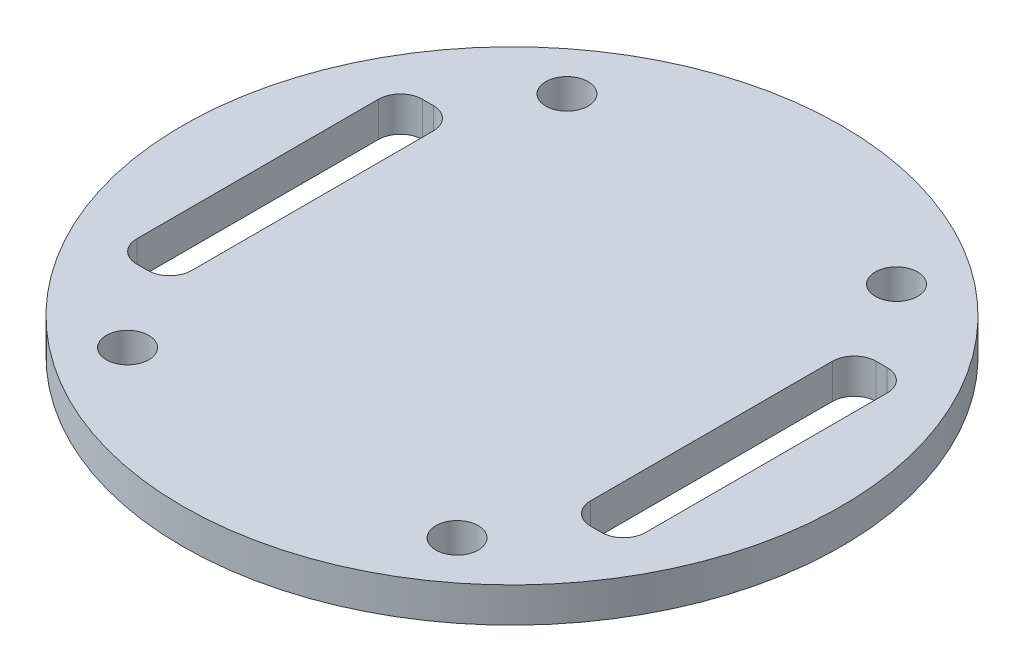
ISO-10303-21;
HEADER;
FILE_DESCRIPTION(('STEP AP214'),'2;1');
FILE_NAME('part.step','',(''),(''),'','','');
FILE_SCHEMA(('AUTOMOTIVE_DESIGN { 1 0 10303 214 1 1 1 1 }'));
ENDSEC;
DATA;
#1=APPLICATION_CONTEXT('core data for automotive mechanical design processes');
#2=APPLICATION_PROTOCOL_DEFINITION('international standard','automotive_design',2000,#1);
#3=PRODUCT_CONTEXT('',#1,'mechanical');
#4=PRODUCT('Part','Part','',(#3));
#5=PRODUCT_RELATED_PRODUCT_CATEGORY('part','',(#4));
#6=PRODUCT_DEFINITION_FORMATION('','',#4);
#7=PRODUCT_DEFINITION_CONTEXT('part definition',#1,'design');
#8=PRODUCT_DEFINITION('design','',#6,#7);
#9=PRODUCT_DEFINITION_SHAPE('','',#8);
#10=(LENGTH_UNIT() NAMED_UNIT(*) SI_UNIT(.MILLI.,.METRE.));
#11=(NAMED_UNIT(*) PLANE_ANGLE_UNIT() SI_UNIT($,.RADIAN.));
#12=(NAMED_UNIT(*) SI_UNIT($,.STERADIAN.) SOLID_ANGLE_UNIT());
#13=UNCERTAINTY_MEASURE_WITH_UNIT(LENGTH_MEASURE(1.E-05),#10,'distance_accuracy_value','');
#14=(GEOMETRIC_REPRESENTATION_CONTEXT(3) GLOBAL_UNCERTAINTY_ASSIGNED_CONTEXT((#13)) GLOBAL_UNIT_ASSIGNED_CONTEXT((#10,
#11,#12)) REPRESENTATION_CONTEXT('',''));
#15=CARTESIAN_POINT('',(0.,0.,0.));
#16=DIRECTION('',(0.,0.,1.));
#17=DIRECTION('',(1.,0.,0.));
#18=AXIS2_PLACEMENT_3D('',#15,#16,#17);
#19=CARTESIAN_POINT('',(0.,1.5875,0.));
#20=DIRECTION('',(0.,-1.,0.));
#21=DIRECTION('',(0.,0.,-1.));
#22=AXIS2_PLACEMENT_3D('',#19,#20,#21);
#23=CYLINDRICAL_SURFACE('',#22,30.);
#24=CARTESIAN_POINT('',(0.,1.5875,0.));
#25=DIRECTION('',(0.,1.,0.));
#26=DIRECTION('',(0.,0.,1.));
#27=AXIS2_PLACEMENT_3D('',#24,#25,#26);
#28=CIRCLE('',#27,30.);
#29=CARTESIAN_POINT('',(0.,1.5875,30.));
#30=VERTEX_POINT('',#29);
#31=EDGE_CURVE('E207',#30,#30,#28,.T.);
#32=ORIENTED_EDGE('',*,*,#31,.F.);
#33=EDGE_LOOP('',(#32));
#34=FACE_BOUND('',#33,.T.);
#35=CARTESIAN_POINT('',(0.,-1.5875,0.));
#36=DIRECTION('',(0.,1.,0.));
#37=DIRECTION('',(0.,0.,1.));
#38=AXIS2_PLACEMENT_3D('',#35,#36,#37);
#39=CIRCLE('',#38,30.);
#40=CARTESIAN_POINT('',(0.,-1.5875,30.));
#41=VERTEX_POINT('',#40);
#42=EDGE_CURVE('E195',#41,#41,#39,.T.);
#43=ORIENTED_EDGE('',*,*,#42,.T.);
#44=EDGE_LOOP('',(#43));
#45=FACE_BOUND('',#44,.T.);
#46=ADVANCED_FACE('F31',(#34,#45),#23,.T.);
#47=CARTESIAN_POINT('',(0.,1.5875,0.));
#48=DIRECTION('',(0.,1.,0.));
#49=DIRECTION('',(0.,0.,1.));
#50=AXIS2_PLACEMENT_3D('',#47,#48,#49);
#51=PLANE('',#50);
#52=CARTESIAN_POINT('',(15.,1.5875,-20.));
#53=DIRECTION('',(0.,1.,0.));
#54=DIRECTION('',(0.,0.,1.));
#55=AXIS2_PLACEMENT_3D('',#52,#53,#54);
#56=CIRCLE('',#55,1.9304);
#57=CARTESIAN_POINT('',(15.,1.5875,-18.0696));
#58=VERTEX_POINT('',#57);
#59=EDGE_CURVE('E550',#58,#58,#56,.T.);
#60=ORIENTED_EDGE('',*,*,#59,.F.);
#61=EDGE_LOOP('',(#60));
#62=FACE_BOUND('',#61,.T.);
#63=CARTESIAN_POINT('',(15.,1.5875,20.));
#64=DIRECTION('',(0.,1.,0.));
#65=DIRECTION('',(0.,0.,1.));
#66=AXIS2_PLACEMENT_3D('',#63,#64,#65);
#67=CIRCLE('',#66,1.9304);
#68=CARTESIAN_POINT('',(15.,1.5875,21.9304));
#69=VERTEX_POINT('',#68);
#70=EDGE_CURVE('E544',#69,#69,#67,.T.);
#71=ORIENTED_EDGE('',*,*,#70,.F.);
#72=EDGE_LOOP('',(#71));
#73=FACE_BOUND('',#72,.T.);
#74=CARTESIAN_POINT('',(-15.,1.5875,20.));
#75=DIRECTION('',(0.,1.,0.));
#76=DIRECTION('',(0.,0.,1.));
#77=AXIS2_PLACEMENT_3D('',#74,#75,#76);
#78=CIRCLE('',#77,1.9304);
#79=CARTESIAN_POINT('',(-15.,1.5875,21.9304));
#80=VERTEX_POINT('',#79);
#81=EDGE_CURVE('E538',#80,#80,#78,.T.);
#82=ORIENTED_EDGE('',*,*,#81,.F.);
#83=EDGE_LOOP('',(#82));
#84=FACE_BOUND('',#83,.T.);
#85=CARTESIAN_POINT('',(-15.,1.5875,-20.));
#86=DIRECTION('',(0.,1.,0.));
#87=DIRECTION('',(0.,0.,1.));
#88=AXIS2_PLACEMENT_3D('',#85,#86,#87);
#89=CIRCLE('',#88,1.9304);
#90=CARTESIAN_POINT('',(-15.,1.5875,-18.0696));
#91=VERTEX_POINT('',#90);
#92=EDGE_CURVE('E532',#91,#91,#89,.T.);
#93=ORIENTED_EDGE('',*,*,#92,.F.);
#94=EDGE_LOOP('',(#93));
#95=FACE_BOUND('',#94,.T.);
#96=DIRECTION('',(0.,0.,-1.));
#97=VECTOR('',#96,1.);
#98=CARTESIAN_POINT('',(23.1571046329841,1.5875,-13.));
#99=LINE('',#98,#97);
#100=CARTESIAN_POINT('',(23.1571046329841,1.5875,11.));
#101=VERTEX_POINT('',#100);
#102=CARTESIAN_POINT('',(23.1571046329841,1.5875,-11.));
#103=VERTEX_POINT('',#102);
#104=EDGE_CURVE('E180',#101,#103,#99,.T.);
#105=ORIENTED_EDGE('',*,*,#104,.F.);
#106=CARTESIAN_POINT('',(21.1571046329841,1.5875,11.));
#107=DIRECTION('',(0.,1.,0.));
#108=DIRECTION('',(0.,0.,1.));
#109=AXIS2_PLACEMENT_3D('',#106,#107,#108);
#110=CIRCLE('',#109,2.);
#111=CARTESIAN_POINT('',(21.1571046329841,1.5875,13.));
#112=VERTEX_POINT('',#111);
#113=EDGE_CURVE('E249',#101,#112,#110,.F.);
#114=ORIENTED_EDGE('',*,*,#113,.T.);
#115=DIRECTION('',(1.,0.,0.));
#116=VECTOR('',#115,1.);
#117=CARTESIAN_POINT('',(23.1571046329841,1.5875,13.));
#118=LINE('',#117,#116);
#119=CARTESIAN_POINT('',(20.1571046329841,1.5875,13.));
#120=VERTEX_POINT('',#119);
#121=EDGE_CURVE('E174',#120,#112,#118,.T.);
#122=ORIENTED_EDGE('',*,*,#121,.F.);
#123=CARTESIAN_POINT('',(20.1571046329841,1.5875,11.));
#124=DIRECTION('',(0.,1.,0.));
#125=DIRECTION('',(0.,0.,1.));
#126=AXIS2_PLACEMENT_3D('',#123,#124,#125);
#127=CIRCLE('',#126,2.);
#128=CARTESIAN_POINT('',(18.1571046329841,1.5875,11.));
#129=VERTEX_POINT('',#128);
#130=EDGE_CURVE('E173',#120,#129,#127,.F.);
#131=ORIENTED_EDGE('',*,*,#130,.T.);
#132=DIRECTION('',(0.,0.,1.));
#133=VECTOR('',#132,1.);
#134=CARTESIAN_POINT('',(18.1571046329841,1.5875,-13.));
#135=LINE('',#134,#133);
#136=CARTESIAN_POINT('',(18.1571046329841,1.5875,-11.));
#137=VERTEX_POINT('',#136);
#138=EDGE_CURVE('E162',#137,#129,#135,.T.);
#139=ORIENTED_EDGE('',*,*,#138,.F.);
#140=CARTESIAN_POINT('',(20.1571046329841,1.5875,-11.));
#141=DIRECTION('',(0.,1.,0.));
#142=DIRECTION('',(0.,0.,1.));
#143=AXIS2_PLACEMENT_3D('',#140,#141,#142);
#144=CIRCLE('',#143,2.);
#145=CARTESIAN_POINT('',(20.1571046329841,1.5875,-13.));
#146=VERTEX_POINT('',#145);
#147=EDGE_CURVE('E145',#137,#146,#144,.F.);
#148=ORIENTED_EDGE('',*,*,#147,.T.);
#149=DIRECTION('',(-1.,0.,0.));
#150=VECTOR('',#149,1.);
#151=CARTESIAN_POINT('',(23.1571046329841,1.5875,-13.));
#152=LINE('',#151,#150);
#153=CARTESIAN_POINT('',(21.1571046329841,1.5875,-13.));
#154=VERTEX_POINT('',#153);
#155=EDGE_CURVE('E175',#154,#146,#152,.T.);
#156=ORIENTED_EDGE('',*,*,#155,.F.);
#157=CARTESIAN_POINT('',(21.1571046329841,1.5875,-11.));
#158=DIRECTION('',(0.,1.,0.));
#159=DIRECTION('',(0.,0.,1.));
#160=AXIS2_PLACEMENT_3D('',#157,#158,#159);
#161=CIRCLE('',#160,2.);
#162=EDGE_CURVE('E245',#154,#103,#161,.F.);
#163=ORIENTED_EDGE('',*,*,#162,.T.);
#164=EDGE_LOOP('',(#105,#114,#122,#131,#139,#148,#156,#163));
#165=FACE_BOUND('',#164,.T.);
#166=DIRECTION('',(0.,0.,1.));
#167=VECTOR('',#166,1.);
#168=CARTESIAN_POINT('',(-23.1571046329841,1.5875,-13.));
#169=LINE('',#168,#167);
#170=CARTESIAN_POINT('',(-23.1571046329841,1.5875,-11.));
#171=VERTEX_POINT('',#170);
#172=CARTESIAN_POINT('',(-23.1571046329841,1.5875,11.));
#173=VERTEX_POINT('',#172);
#174=EDGE_CURVE('E196',#171,#173,#169,.T.);
#175=ORIENTED_EDGE('',*,*,#174,.F.);
#176=CARTESIAN_POINT('',(-21.1571046329841,1.5875,-11.));
#177=DIRECTION('',(0.,1.,0.));
#178=DIRECTION('',(0.,0.,1.));
#179=AXIS2_PLACEMENT_3D('',#176,#177,#178);
#180=CIRCLE('',#179,2.);
#181=CARTESIAN_POINT('',(-21.1571046329841,1.5875,-13.));
#182=VERTEX_POINT('',#181);
#183=EDGE_CURVE('E39',#171,#182,#180,.F.);
#184=ORIENTED_EDGE('',*,*,#183,.T.);
#185=DIRECTION('',(-1.,0.,0.));
#186=VECTOR('',#185,1.);
#187=CARTESIAN_POINT('',(-23.1571046329841,1.5875,-13.));
#188=LINE('',#187,#186);
#189=CARTESIAN_POINT('',(-20.1571046329841,1.5875,-13.));
#190=VERTEX_POINT('',#189);
#191=EDGE_CURVE('E188',#190,#182,#188,.T.);
#192=ORIENTED_EDGE('',*,*,#191,.F.);
#193=CARTESIAN_POINT('',(-20.1571046329841,1.5875,-11.));
#194=DIRECTION('',(0.,1.,0.));
#195=DIRECTION('',(0.,0.,1.));
#196=AXIS2_PLACEMENT_3D('',#193,#194,#195);
#197=CIRCLE('',#196,2.);
#198=CARTESIAN_POINT('',(-18.1571046329841,1.5875,-11.));
#199=VERTEX_POINT('',#198);
#200=EDGE_CURVE('E264',#190,#199,#197,.F.);
#201=ORIENTED_EDGE('',*,*,#200,.T.);
#202=DIRECTION('',(0.,0.,-1.));
#203=VECTOR('',#202,1.);
#204=CARTESIAN_POINT('',(-18.1571046329841,1.5875,-13.));
#205=LINE('',#204,#203);
#206=CARTESIAN_POINT('',(-18.1571046329841,1.5875,11.));
#207=VERTEX_POINT('',#206);
#208=EDGE_CURVE('E203',#207,#199,#205,.T.);
#209=ORIENTED_EDGE('',*,*,#208,.F.);
#210=CARTESIAN_POINT('',(-20.1571046329841,1.5875,11.));
#211=DIRECTION('',(0.,1.,0.));
#212=DIRECTION('',(0.,0.,1.));
#213=AXIS2_PLACEMENT_3D('',#210,#211,#212);
#214=CIRCLE('',#213,2.);
#215=CARTESIAN_POINT('',(-20.1571046329841,1.5875,13.));
#216=VERTEX_POINT('',#215);
#217=EDGE_CURVE('E260',#207,#216,#214,.F.);
#218=ORIENTED_EDGE('',*,*,#217,.T.);
#219=DIRECTION('',(1.,0.,0.));
#220=VECTOR('',#219,1.);
#221=CARTESIAN_POINT('',(-23.1571046329841,1.5875,13.));
#222=LINE('',#221,#220);
#223=CARTESIAN_POINT('',(-21.1571046329841,1.5875,13.));
#224=VERTEX_POINT('',#223);
#225=EDGE_CURVE('E199',#224,#216,#222,.T.);
#226=ORIENTED_EDGE('',*,*,#225,.F.);
#227=CARTESIAN_POINT('',(-21.1571046329841,1.5875,11.));
#228=DIRECTION('',(0.,1.,0.));
#229=DIRECTION('',(0.,0.,1.));
#230=AXIS2_PLACEMENT_3D('',#227,#228,#229);
#231=CIRCLE('',#230,2.);
#232=EDGE_CURVE('E256',#224,#173,#231,.F.);
#233=ORIENTED_EDGE('',*,*,#232,.T.);
#234=EDGE_LOOP('',(#175,#184,#192,#201,#209,#218,#226,#233));
#235=FACE_BOUND('',#234,.T.);
#236=ORIENTED_EDGE('',*,*,#31,.T.);
#237=EDGE_LOOP('',(#236));
#238=FACE_BOUND('',#237,.T.);
#239=ADVANCED_FACE('F170',(#62,#73,#84,#95,#165,#235,#238),#51,.T.);
#240=CARTESIAN_POINT('',(0.,-1.5875,0.));
#241=DIRECTION('',(0.,1.,0.));
#242=DIRECTION('',(0.,0.,1.));
#243=AXIS2_PLACEMENT_3D('',#240,#241,#242);
#244=PLANE('',#243);
#245=CARTESIAN_POINT('',(15.,-1.5875,-20.));
#246=DIRECTION('',(0.,1.,0.));
#247=DIRECTION('',(0.,0.,1.));
#248=AXIS2_PLACEMENT_3D('',#245,#246,#247);
#249=CIRCLE('',#248,1.9304);
#250=CARTESIAN_POINT('',(15.,-1.5875,-18.0696));
#251=VERTEX_POINT('',#250);
#252=EDGE_CURVE('E547',#251,#251,#249,.T.);
#253=ORIENTED_EDGE('',*,*,#252,.T.);
#254=EDGE_LOOP('',(#253));
#255=FACE_BOUND('',#254,.T.);
#256=CARTESIAN_POINT('',(15.,-1.5875,20.));
#257=DIRECTION('',(0.,1.,0.));
#258=DIRECTION('',(0.,0.,1.));
#259=AXIS2_PLACEMENT_3D('',#256,#257,#258);
#260=CIRCLE('',#259,1.9304);
#261=CARTESIAN_POINT('',(15.,-1.5875,21.9304));
#262=VERTEX_POINT('',#261);
#263=EDGE_CURVE('E541',#262,#262,#260,.T.);
#264=ORIENTED_EDGE('',*,*,#263,.T.);
#265=EDGE_LOOP('',(#264));
#266=FACE_BOUND('',#265,.T.);
#267=CARTESIAN_POINT('',(-15.,-1.5875,20.));
#268=DIRECTION('',(0.,1.,0.));
#269=DIRECTION('',(0.,0.,1.));
#270=AXIS2_PLACEMENT_3D('',#267,#268,#269);
#271=CIRCLE('',#270,1.9304);
#272=CARTESIAN_POINT('',(-15.,-1.5875,21.9304));
#273=VERTEX_POINT('',#272);
#274=EDGE_CURVE('E535',#273,#273,#271,.T.);
#275=ORIENTED_EDGE('',*,*,#274,.T.);
#276=EDGE_LOOP('',(#275));
#277=FACE_BOUND('',#276,.T.);
#278=CARTESIAN_POINT('',(-15.,-1.5875,-20.));
#279=DIRECTION('',(0.,1.,0.));
#280=DIRECTION('',(0.,0.,1.));
#281=AXIS2_PLACEMENT_3D('',#278,#279,#280);
#282=CIRCLE('',#281,1.9304);
#283=CARTESIAN_POINT('',(-15.,-1.5875,-18.0696));
#284=VERTEX_POINT('',#283);
#285=EDGE_CURVE('E514',#284,#284,#282,.T.);
#286=ORIENTED_EDGE('',*,*,#285,.T.);
#287=EDGE_LOOP('',(#286));
#288=FACE_BOUND('',#287,.T.);
#289=DIRECTION('',(0.,0.,1.));
#290=VECTOR('',#289,1.);
#291=CARTESIAN_POINT('',(18.1571046329841,-1.5875,-13.));
#292=LINE('',#291,#290);
#293=CARTESIAN_POINT('',(18.1571046329841,-1.5875,-11.));
#294=VERTEX_POINT('',#293);
#295=CARTESIAN_POINT('',(18.1571046329841,-1.5875,11.));
#296=VERTEX_POINT('',#295);
#297=EDGE_CURVE('E165',#294,#296,#292,.T.);
#298=ORIENTED_EDGE('',*,*,#297,.T.);
#299=CARTESIAN_POINT('',(20.1571046329841,-1.5875,11.));
#300=DIRECTION('',(0.,1.,0.));
#301=DIRECTION('',(0.,0.,1.));
#302=AXIS2_PLACEMENT_3D('',#299,#300,#301);
#303=CIRCLE('',#302,2.);
#304=CARTESIAN_POINT('',(20.1571046329841,-1.5875,13.));
#305=VERTEX_POINT('',#304);
#306=EDGE_CURVE('E254',#296,#305,#303,.T.);
#307=ORIENTED_EDGE('',*,*,#306,.T.);
#308=DIRECTION('',(1.,0.,0.));
#309=VECTOR('',#308,1.);
#310=CARTESIAN_POINT('',(23.1571046329841,-1.5875,13.));
#311=LINE('',#310,#309);
#312=CARTESIAN_POINT('',(21.1571046329841,-1.5875,13.));
#313=VERTEX_POINT('',#312);
#314=EDGE_CURVE('E200',#305,#313,#311,.T.);
#315=ORIENTED_EDGE('',*,*,#314,.T.);
#316=CARTESIAN_POINT('',(21.1571046329841,-1.5875,11.));
#317=DIRECTION('',(0.,1.,0.));
#318=DIRECTION('',(0.,0.,1.));
#319=AXIS2_PLACEMENT_3D('',#316,#317,#318);
#320=CIRCLE('',#319,2.);
#321=CARTESIAN_POINT('',(23.1571046329841,-1.5875,11.));
#322=VERTEX_POINT('',#321);
#323=EDGE_CURVE('E251',#313,#322,#320,.T.);
#324=ORIENTED_EDGE('',*,*,#323,.T.);
#325=DIRECTION('',(0.,0.,-1.));
#326=VECTOR('',#325,1.);
#327=CARTESIAN_POINT('',(23.1571046329841,-1.5875,-13.));
#328=LINE('',#327,#326);
#329=CARTESIAN_POINT('',(23.1571046329841,-1.5875,-11.));
#330=VERTEX_POINT('',#329);
#331=EDGE_CURVE('E178',#322,#330,#328,.T.);
#332=ORIENTED_EDGE('',*,*,#331,.T.);
#333=CARTESIAN_POINT('',(21.1571046329841,-1.5875,-11.));
#334=DIRECTION('',(0.,1.,0.));
#335=DIRECTION('',(0.,0.,1.));
#336=AXIS2_PLACEMENT_3D('',#333,#334,#335);
#337=CIRCLE('',#336,2.);
#338=CARTESIAN_POINT('',(21.1571046329841,-1.5875,-13.));
#339=VERTEX_POINT('',#338);
#340=EDGE_CURVE('E247',#330,#339,#337,.T.);
#341=ORIENTED_EDGE('',*,*,#340,.T.);
#342=DIRECTION('',(-1.,0.,0.));
#343=VECTOR('',#342,1.);
#344=CARTESIAN_POINT('',(23.1571046329841,-1.5875,-13.));
#345=LINE('',#344,#343);
#346=CARTESIAN_POINT('',(20.1571046329841,-1.5875,-13.));
#347=VERTEX_POINT('',#346);
#348=EDGE_CURVE('E520',#339,#347,#345,.T.);
#349=ORIENTED_EDGE('',*,*,#348,.T.);
#350=CARTESIAN_POINT('',(20.1571046329841,-1.5875,-11.));
#351=DIRECTION('',(0.,1.,0.));
#352=DIRECTION('',(0.,0.,1.));
#353=AXIS2_PLACEMENT_3D('',#350,#351,#352);
#354=CIRCLE('',#353,2.);
#355=EDGE_CURVE('E155',#347,#294,#354,.T.);
#356=ORIENTED_EDGE('',*,*,#355,.T.);
#357=EDGE_LOOP('',(#298,#307,#315,#324,#332,#341,#349,#356));
#358=FACE_BOUND('',#357,.T.);
#359=DIRECTION('',(0.,0.,-1.));
#360=VECTOR('',#359,1.);
#361=CARTESIAN_POINT('',(-18.1571046329841,-1.5875,-13.));
#362=LINE('',#361,#360);
#363=CARTESIAN_POINT('',(-18.1571046329841,-1.5875,11.));
#364=VERTEX_POINT('',#363);
#365=CARTESIAN_POINT('',(-18.1571046329841,-1.5875,-11.));
#366=VERTEX_POINT('',#365);
#367=EDGE_CURVE('E191',#364,#366,#362,.T.);
#368=ORIENTED_EDGE('',*,*,#367,.T.);
#369=CARTESIAN_POINT('',(-20.1571046329841,-1.5875,-11.));
#370=DIRECTION('',(0.,1.,0.));
#371=DIRECTION('',(0.,0.,1.));
#372=AXIS2_PLACEMENT_3D('',#369,#370,#371);
#373=CIRCLE('',#372,2.);
#374=CARTESIAN_POINT('',(-20.1571046329841,-1.5875,-13.));
#375=VERTEX_POINT('',#374);
#376=EDGE_CURVE('E53',#366,#375,#373,.T.);
#377=ORIENTED_EDGE('',*,*,#376,.T.);
#378=DIRECTION('',(-1.,0.,0.));
#379=VECTOR('',#378,1.);
#380=CARTESIAN_POINT('',(-23.1571046329841,-1.5875,-13.));
#381=LINE('',#380,#379);
#382=CARTESIAN_POINT('',(-21.1571046329841,-1.5875,-13.));
#383=VERTEX_POINT('',#382);
#384=EDGE_CURVE('E193',#375,#383,#381,.T.);
#385=ORIENTED_EDGE('',*,*,#384,.T.);
#386=CARTESIAN_POINT('',(-21.1571046329841,-1.5875,-11.));
#387=DIRECTION('',(0.,1.,0.));
#388=DIRECTION('',(0.,0.,1.));
#389=AXIS2_PLACEMENT_3D('',#386,#387,#388);
#390=CIRCLE('',#389,2.);
#391=CARTESIAN_POINT('',(-23.1571046329841,-1.5875,-11.));
#392=VERTEX_POINT('',#391);
#393=EDGE_CURVE('E11',#383,#392,#390,.T.);
#394=ORIENTED_EDGE('',*,*,#393,.T.);
#395=DIRECTION('',(0.,0.,1.));
#396=VECTOR('',#395,1.);
#397=CARTESIAN_POINT('',(-23.1571046329841,-1.5875,-13.));
#398=LINE('',#397,#396);
#399=CARTESIAN_POINT('',(-23.1571046329841,-1.5875,11.));
#400=VERTEX_POINT('',#399);
#401=EDGE_CURVE('E184',#392,#400,#398,.T.);
#402=ORIENTED_EDGE('',*,*,#401,.T.);
#403=CARTESIAN_POINT('',(-21.1571046329841,-1.5875,11.));
#404=DIRECTION('',(0.,1.,0.));
#405=DIRECTION('',(0.,0.,1.));
#406=AXIS2_PLACEMENT_3D('',#403,#404,#405);
#407=CIRCLE('',#406,2.);
#408=CARTESIAN_POINT('',(-21.1571046329841,-1.5875,13.));
#409=VERTEX_POINT('',#408);
#410=EDGE_CURVE('E258',#400,#409,#407,.T.);
#411=ORIENTED_EDGE('',*,*,#410,.T.);
#412=DIRECTION('',(1.,0.,0.));
#413=VECTOR('',#412,1.);
#414=CARTESIAN_POINT('',(-23.1571046329841,-1.5875,13.));
#415=LINE('',#414,#413);
#416=CARTESIAN_POINT('',(-20.1571046329841,-1.5875,13.));
#417=VERTEX_POINT('',#416);
#418=EDGE_CURVE('E187',#409,#417,#415,.T.);
#419=ORIENTED_EDGE('',*,*,#418,.T.);
#420=CARTESIAN_POINT('',(-20.1571046329841,-1.5875,11.));
#421=DIRECTION('',(0.,1.,0.));
#422=DIRECTION('',(0.,0.,1.));
#423=AXIS2_PLACEMENT_3D('',#420,#421,#422);
#424=CIRCLE('',#423,2.);
#425=EDGE_CURVE('E262',#417,#364,#424,.T.);
#426=ORIENTED_EDGE('',*,*,#425,.T.);
#427=EDGE_LOOP('',(#368,#377,#385,#394,#402,#411,#419,#426));
#428=FACE_BOUND('',#427,.T.);
#429=ORIENTED_EDGE('',*,*,#42,.F.);
#430=EDGE_LOOP('',(#429));
#431=FACE_BOUND('',#430,.T.);
#432=ADVANCED_FACE('F275',(#255,#266,#277,#288,#358,#428,#431),#244,.F.);
#433=CARTESIAN_POINT('',(-23.1571046329841,-1.5875,-13.));
#434=DIRECTION('',(-1.,0.,0.));
#435=DIRECTION('',(0.,0.,1.));
#436=AXIS2_PLACEMENT_3D('',#433,#434,#435);
#437=PLANE('',#436);
#438=ORIENTED_EDGE('',*,*,#174,.T.);
#439=DIRECTION('',(0.,1.,0.));
#440=VECTOR('',#439,1.);
#441=CARTESIAN_POINT('',(-23.1571046329841,-1.5875,11.));
#442=LINE('',#441,#440);
#443=EDGE_CURVE('E234',#173,#400,#442,.F.);
#444=ORIENTED_EDGE('',*,*,#443,.T.);
#445=ORIENTED_EDGE('',*,*,#401,.F.);
#446=DIRECTION('',(0.,1.,0.));
#447=VECTOR('',#446,1.);
#448=CARTESIAN_POINT('',(-23.1571046329841,1.5875,-11.));
#449=LINE('',#448,#447);
#450=EDGE_CURVE('E231',#392,#171,#449,.T.);
#451=ORIENTED_EDGE('',*,*,#450,.T.);
#452=EDGE_LOOP('',(#438,#444,#445,#451));
#453=FACE_BOUND('',#452,.T.);
#454=ADVANCED_FACE('F279',(#453),#437,.F.);
#455=CARTESIAN_POINT('',(-23.1571046329841,-1.5875,-13.));
#456=DIRECTION('',(0.,0.,-1.));
#457=DIRECTION('',(-1.,0.,0.));
#458=AXIS2_PLACEMENT_3D('',#455,#456,#457);
#459=PLANE('',#458);
#460=ORIENTED_EDGE('',*,*,#384,.F.);
#461=DIRECTION('',(0.,1.,0.));
#462=VECTOR('',#461,1.);
#463=CARTESIAN_POINT('',(-20.1571046329841,1.5875,-13.));
#464=LINE('',#463,#462);
#465=EDGE_CURVE('E156',#375,#190,#464,.T.);
#466=ORIENTED_EDGE('',*,*,#465,.T.);
#467=ORIENTED_EDGE('',*,*,#191,.T.);
#468=DIRECTION('',(0.,1.,0.));
#469=VECTOR('',#468,1.);
#470=CARTESIAN_POINT('',(-21.1571046329841,-1.5875,-13.));
#471=LINE('',#470,#469);
#472=EDGE_CURVE('E46',#182,#383,#471,.F.);
#473=ORIENTED_EDGE('',*,*,#472,.T.);
#474=EDGE_LOOP('',(#460,#466,#467,#473));
#475=FACE_BOUND('',#474,.T.);
#476=ADVANCED_FACE('F271',(#475),#459,.F.);
#477=CARTESIAN_POINT('',(-18.1571046329841,-1.5875,-13.));
#478=DIRECTION('',(1.,0.,0.));
#479=DIRECTION('',(0.,0.,-1.));
#480=AXIS2_PLACEMENT_3D('',#477,#478,#479);
#481=PLANE('',#480);
#482=ORIENTED_EDGE('',*,*,#367,.F.);
#483=DIRECTION('',(0.,1.,0.));
#484=VECTOR('',#483,1.);
#485=CARTESIAN_POINT('',(-18.1571046329841,1.5875,11.));
#486=LINE('',#485,#484);
#487=EDGE_CURVE('E238',#364,#207,#486,.T.);
#488=ORIENTED_EDGE('',*,*,#487,.T.);
#489=ORIENTED_EDGE('',*,*,#208,.T.);
#490=DIRECTION('',(0.,1.,0.));
#491=VECTOR('',#490,1.);
#492=CARTESIAN_POINT('',(-18.1571046329841,-1.5875,-11.));
#493=LINE('',#492,#491);
#494=EDGE_CURVE('E236',#199,#366,#493,.F.);
#495=ORIENTED_EDGE('',*,*,#494,.T.);
#496=EDGE_LOOP('',(#482,#488,#489,#495));
#497=FACE_BOUND('',#496,.T.);
#498=ADVANCED_FACE('F295',(#497),#481,.F.);
#499=CARTESIAN_POINT('',(-23.1571046329841,-1.5875,13.));
#500=DIRECTION('',(0.,0.,1.));
#501=DIRECTION('',(1.,0.,0.));
#502=AXIS2_PLACEMENT_3D('',#499,#500,#501);
#503=PLANE('',#502);
#504=ORIENTED_EDGE('',*,*,#418,.F.);
#505=DIRECTION('',(0.,1.,0.));
#506=VECTOR('',#505,1.);
#507=CARTESIAN_POINT('',(-21.1571046329841,1.5875,13.));
#508=LINE('',#507,#506);
#509=EDGE_CURVE('E228',#409,#224,#508,.T.);
#510=ORIENTED_EDGE('',*,*,#509,.T.);
#511=ORIENTED_EDGE('',*,*,#225,.T.);
#512=DIRECTION('',(0.,1.,0.));
#513=VECTOR('',#512,1.);
#514=CARTESIAN_POINT('',(-20.1571046329841,-1.5875,13.));
#515=LINE('',#514,#513);
#516=EDGE_CURVE('E226',#216,#417,#515,.F.);
#517=ORIENTED_EDGE('',*,*,#516,.T.);
#518=EDGE_LOOP('',(#504,#510,#511,#517));
#519=FACE_BOUND('',#518,.T.);
#520=ADVANCED_FACE('F287',(#519),#503,.F.);
#521=CARTESIAN_POINT('',(23.1571046329841,-1.5875,-13.));
#522=DIRECTION('',(1.,0.,0.));
#523=DIRECTION('',(0.,0.,-1.));
#524=AXIS2_PLACEMENT_3D('',#521,#522,#523);
#525=PLANE('',#524);
#526=ORIENTED_EDGE('',*,*,#104,.T.);
#527=DIRECTION('',(0.,1.,0.));
#528=VECTOR('',#527,1.);
#529=CARTESIAN_POINT('',(23.1571046329841,-1.5875,-11.));
#530=LINE('',#529,#528);
#531=EDGE_CURVE('E219',#103,#330,#530,.F.);
#532=ORIENTED_EDGE('',*,*,#531,.T.);
#533=ORIENTED_EDGE('',*,*,#331,.F.);
#534=DIRECTION('',(0.,1.,0.));
#535=VECTOR('',#534,1.);
#536=CARTESIAN_POINT('',(23.1571046329841,1.5875,11.));
#537=LINE('',#536,#535);
#538=EDGE_CURVE('E216',#322,#101,#537,.T.);
#539=ORIENTED_EDGE('',*,*,#538,.T.);
#540=EDGE_LOOP('',(#526,#532,#533,#539));
#541=FACE_BOUND('',#540,.T.);
#542=ADVANCED_FACE('F419',(#541),#525,.F.);
#543=CARTESIAN_POINT('',(23.1571046329841,-1.5875,13.));
#544=DIRECTION('',(0.,0.,1.));
#545=DIRECTION('',(1.,0.,0.));
#546=AXIS2_PLACEMENT_3D('',#543,#544,#545);
#547=PLANE('',#546);
#548=ORIENTED_EDGE('',*,*,#121,.T.);
#549=DIRECTION('',(0.,1.,0.));
#550=VECTOR('',#549,1.);
#551=CARTESIAN_POINT('',(21.1571046329841,-1.5875,13.));
#552=LINE('',#551,#550);
#553=EDGE_CURVE('E224',#112,#313,#552,.F.);
#554=ORIENTED_EDGE('',*,*,#553,.T.);
#555=ORIENTED_EDGE('',*,*,#314,.F.);
#556=DIRECTION('',(0.,1.,0.));
#557=VECTOR('',#556,1.);
#558=CARTESIAN_POINT('',(20.1571046329841,1.5875,13.));
#559=LINE('',#558,#557);
#560=EDGE_CURVE('E221',#305,#120,#559,.T.);
#561=ORIENTED_EDGE('',*,*,#560,.T.);
#562=EDGE_LOOP('',(#548,#554,#555,#561));
#563=FACE_BOUND('',#562,.T.);
#564=ADVANCED_FACE('F416',(#563),#547,.F.);
#565=CARTESIAN_POINT('',(18.1571046329841,-1.5875,-13.));
#566=DIRECTION('',(-1.,0.,0.));
#567=DIRECTION('',(0.,0.,1.));
#568=AXIS2_PLACEMENT_3D('',#565,#566,#567);
#569=PLANE('',#568);
#570=ORIENTED_EDGE('',*,*,#297,.F.);
#571=DIRECTION('',(0.,1.,0.));
#572=VECTOR('',#571,1.);
#573=CARTESIAN_POINT('',(18.1571046329841,1.5875,-11.));
#574=LINE('',#573,#572);
#575=EDGE_CURVE('E149',#294,#137,#574,.T.);
#576=ORIENTED_EDGE('',*,*,#575,.T.);
#577=ORIENTED_EDGE('',*,*,#138,.T.);
#578=DIRECTION('',(0.,1.,0.));
#579=VECTOR('',#578,1.);
#580=CARTESIAN_POINT('',(18.1571046329841,-1.5875,11.));
#581=LINE('',#580,#579);
#582=EDGE_CURVE('E167',#129,#296,#581,.F.);
#583=ORIENTED_EDGE('',*,*,#582,.T.);
#584=EDGE_LOOP('',(#570,#576,#577,#583));
#585=FACE_BOUND('',#584,.T.);
#586=ADVANCED_FACE('F161',(#585),#569,.F.);
#587=CARTESIAN_POINT('',(23.1571046329841,-1.5875,-13.));
#588=DIRECTION('',(0.,0.,-1.));
#589=DIRECTION('',(-1.,0.,0.));
#590=AXIS2_PLACEMENT_3D('',#587,#588,#589);
#591=PLANE('',#590);
#592=ORIENTED_EDGE('',*,*,#155,.T.);
#593=DIRECTION('',(0.,1.,0.));
#594=VECTOR('',#593,1.);
#595=CARTESIAN_POINT('',(20.1571046329841,-1.5875,-13.));
#596=LINE('',#595,#594);
#597=EDGE_CURVE('E150',#146,#347,#596,.F.);
#598=ORIENTED_EDGE('',*,*,#597,.T.);
#599=ORIENTED_EDGE('',*,*,#348,.F.);
#600=DIRECTION('',(0.,1.,0.));
#601=VECTOR('',#600,1.);
#602=CARTESIAN_POINT('',(21.1571046329841,1.5875,-13.));
#603=LINE('',#602,#601);
#604=EDGE_CURVE('E166',#339,#154,#603,.T.);
#605=ORIENTED_EDGE('',*,*,#604,.T.);
#606=EDGE_LOOP('',(#592,#598,#599,#605));
#607=FACE_BOUND('',#606,.T.);
#608=ADVANCED_FACE('F322',(#607),#591,.F.);
#609=CARTESIAN_POINT('',(20.1571046329841,-1.5875,-11.));
#610=DIRECTION('',(0.,-1.,0.));
#611=DIRECTION('',(0.,0.,-1.));
#612=AXIS2_PLACEMENT_3D('',#609,#610,#611);
#613=CYLINDRICAL_SURFACE('',#612,2.);
#614=ORIENTED_EDGE('',*,*,#355,.F.);
#615=ORIENTED_EDGE('',*,*,#597,.F.);
#616=ORIENTED_EDGE('',*,*,#147,.F.);
#617=ORIENTED_EDGE('',*,*,#575,.F.);
#618=EDGE_LOOP('',(#614,#615,#616,#617));
#619=FACE_BOUND('',#618,.T.);
#620=ADVANCED_FACE('F148',(#619),#613,.F.);
#621=CARTESIAN_POINT('',(21.1571046329841,-1.5875,-11.));
#622=DIRECTION('',(0.,-1.,0.));
#623=DIRECTION('',(0.,0.,-1.));
#624=AXIS2_PLACEMENT_3D('',#621,#622,#623);
#625=CYLINDRICAL_SURFACE('',#624,2.);
#626=ORIENTED_EDGE('',*,*,#340,.F.);
#627=ORIENTED_EDGE('',*,*,#531,.F.);
#628=ORIENTED_EDGE('',*,*,#162,.F.);
#629=ORIENTED_EDGE('',*,*,#604,.F.);
#630=EDGE_LOOP('',(#626,#627,#628,#629));
#631=FACE_BOUND('',#630,.T.);
#632=ADVANCED_FACE('F321',(#631),#625,.F.);
#633=CARTESIAN_POINT('',(21.1571046329841,-1.5875,11.));
#634=DIRECTION('',(0.,-1.,0.));
#635=DIRECTION('',(0.,0.,-1.));
#636=AXIS2_PLACEMENT_3D('',#633,#634,#635);
#637=CYLINDRICAL_SURFACE('',#636,2.);
#638=ORIENTED_EDGE('',*,*,#323,.F.);
#639=ORIENTED_EDGE('',*,*,#553,.F.);
#640=ORIENTED_EDGE('',*,*,#113,.F.);
#641=ORIENTED_EDGE('',*,*,#538,.F.);
#642=EDGE_LOOP('',(#638,#639,#640,#641));
#643=FACE_BOUND('',#642,.T.);
#644=ADVANCED_FACE('F325',(#643),#637,.F.);
#645=CARTESIAN_POINT('',(20.1571046329841,-1.5875,11.));
#646=DIRECTION('',(0.,-1.,0.));
#647=DIRECTION('',(0.,0.,-1.));
#648=AXIS2_PLACEMENT_3D('',#645,#646,#647);
#649=CYLINDRICAL_SURFACE('',#648,2.);
#650=ORIENTED_EDGE('',*,*,#306,.F.);
#651=ORIENTED_EDGE('',*,*,#582,.F.);
#652=ORIENTED_EDGE('',*,*,#130,.F.);
#653=ORIENTED_EDGE('',*,*,#560,.F.);
#654=EDGE_LOOP('',(#650,#651,#652,#653));
#655=FACE_BOUND('',#654,.T.);
#656=ADVANCED_FACE('F329',(#655),#649,.F.);
#657=CARTESIAN_POINT('',(-21.1571046329841,-1.5875,11.));
#658=DIRECTION('',(0.,-1.,0.));
#659=DIRECTION('',(0.,0.,-1.));
#660=AXIS2_PLACEMENT_3D('',#657,#658,#659);
#661=CYLINDRICAL_SURFACE('',#660,2.);
#662=ORIENTED_EDGE('',*,*,#410,.F.);
#663=ORIENTED_EDGE('',*,*,#443,.F.);
#664=ORIENTED_EDGE('',*,*,#232,.F.);
#665=ORIENTED_EDGE('',*,*,#509,.F.);
#666=EDGE_LOOP('',(#662,#663,#664,#665));
#667=FACE_BOUND('',#666,.T.);
#668=ADVANCED_FACE('F282',(#667),#661,.F.);
#669=CARTESIAN_POINT('',(-20.1571046329841,-1.5875,11.));
#670=DIRECTION('',(0.,-1.,0.));
#671=DIRECTION('',(0.,0.,-1.));
#672=AXIS2_PLACEMENT_3D('',#669,#670,#671);
#673=CYLINDRICAL_SURFACE('',#672,2.);
#674=ORIENTED_EDGE('',*,*,#425,.F.);
#675=ORIENTED_EDGE('',*,*,#516,.F.);
#676=ORIENTED_EDGE('',*,*,#217,.F.);
#677=ORIENTED_EDGE('',*,*,#487,.F.);
#678=EDGE_LOOP('',(#674,#675,#676,#677));
#679=FACE_BOUND('',#678,.T.);
#680=ADVANCED_FACE('F291',(#679),#673,.F.);
#681=CARTESIAN_POINT('',(-20.1571046329841,-1.5875,-11.));
#682=DIRECTION('',(0.,-1.,0.));
#683=DIRECTION('',(0.,0.,-1.));
#684=AXIS2_PLACEMENT_3D('',#681,#682,#683);
#685=CYLINDRICAL_SURFACE('',#684,2.);
#686=ORIENTED_EDGE('',*,*,#376,.F.);
#687=ORIENTED_EDGE('',*,*,#494,.F.);
#688=ORIENTED_EDGE('',*,*,#200,.F.);
#689=ORIENTED_EDGE('',*,*,#465,.F.);
#690=EDGE_LOOP('',(#686,#687,#688,#689));
#691=FACE_BOUND('',#690,.T.);
#692=ADVANCED_FACE('F299',(#691),#685,.F.);
#693=CARTESIAN_POINT('',(-21.1571046329841,-1.5875,-11.));
#694=DIRECTION('',(0.,-1.,0.));
#695=DIRECTION('',(0.,0.,-1.));
#696=AXIS2_PLACEMENT_3D('',#693,#694,#695);
#697=CYLINDRICAL_SURFACE('',#696,2.);
#698=ORIENTED_EDGE('',*,*,#393,.F.);
#699=ORIENTED_EDGE('',*,*,#472,.F.);
#700=ORIENTED_EDGE('',*,*,#183,.F.);
#701=ORIENTED_EDGE('',*,*,#450,.F.);
#702=EDGE_LOOP('',(#698,#699,#700,#701));
#703=FACE_BOUND('',#702,.T.);
#704=ADVANCED_FACE('F33',(#703),#697,.F.);
#705=CARTESIAN_POINT('',(-15.,-1.5875,-20.));
#706=DIRECTION('',(0.,1.,0.));
#707=DIRECTION('',(0.,0.,1.));
#708=AXIS2_PLACEMENT_3D('',#705,#706,#707);
#709=CYLINDRICAL_SURFACE('',#708,1.9304);
#710=ORIENTED_EDGE('',*,*,#285,.F.);
#711=EDGE_LOOP('',(#710));
#712=FACE_BOUND('',#711,.T.);
#713=ORIENTED_EDGE('',*,*,#92,.T.);
#714=EDGE_LOOP('',(#713));
#715=FACE_BOUND('',#714,.T.);
#716=ADVANCED_FACE('F305',(#712,#715),#709,.F.);
#717=CARTESIAN_POINT('',(-15.,-1.5875,20.));
#718=DIRECTION('',(0.,1.,0.));
#719=DIRECTION('',(0.,0.,1.));
#720=AXIS2_PLACEMENT_3D('',#717,#718,#719);
#721=CYLINDRICAL_SURFACE('',#720,1.9304);
#722=ORIENTED_EDGE('',*,*,#274,.F.);
#723=EDGE_LOOP('',(#722));
#724=FACE_BOUND('',#723,.T.);
#725=ORIENTED_EDGE('',*,*,#81,.T.);
#726=EDGE_LOOP('',(#725));
#727=FACE_BOUND('',#726,.T.);
#728=ADVANCED_FACE('F379',(#724,#727),#721,.F.);
#729=CARTESIAN_POINT('',(15.,-1.5875,20.));
#730=DIRECTION('',(0.,1.,0.));
#731=DIRECTION('',(0.,0.,1.));
#732=AXIS2_PLACEMENT_3D('',#729,#730,#731);
#733=CYLINDRICAL_SURFACE('',#732,1.9304);
#734=ORIENTED_EDGE('',*,*,#263,.F.);
#735=EDGE_LOOP('',(#734));
#736=FACE_BOUND('',#735,.T.);
#737=ORIENTED_EDGE('',*,*,#70,.T.);
#738=EDGE_LOOP('',(#737));
#739=FACE_BOUND('',#738,.T.);
#740=ADVANCED_FACE('F389',(#736,#739),#733,.F.);
#741=CARTESIAN_POINT('',(15.,-1.5875,-20.));
#742=DIRECTION('',(0.,1.,0.));
#743=DIRECTION('',(0.,0.,1.));
#744=AXIS2_PLACEMENT_3D('',#741,#742,#743);
#745=CYLINDRICAL_SURFACE('',#744,1.9304);
#746=ORIENTED_EDGE('',*,*,#252,.F.);
#747=EDGE_LOOP('',(#746));
#748=FACE_BOUND('',#747,.T.);
#749=ORIENTED_EDGE('',*,*,#59,.T.);
#750=EDGE_LOOP('',(#749));
#751=FACE_BOUND('',#750,.T.);
#752=ADVANCED_FACE('F399',(#748,#751),#745,.F.);
#753=CLOSED_SHELL('',(#46,#239,#432,#454,#476,#498,#520,#542,#564,#586,#608,#620,#632,#644,#656,
#668,#680,#692,#704,#716,#728,#740,#752));
#754=MANIFOLD_SOLID_BREP('B2',#753);
#755=ADVANCED_BREP_SHAPE_REPRESENTATION('',(#18,#754),#14);
#756=SHAPE_DEFINITION_REPRESENTATION(#9,#755);
ENDSEC;
END-ISO-10303-21;
